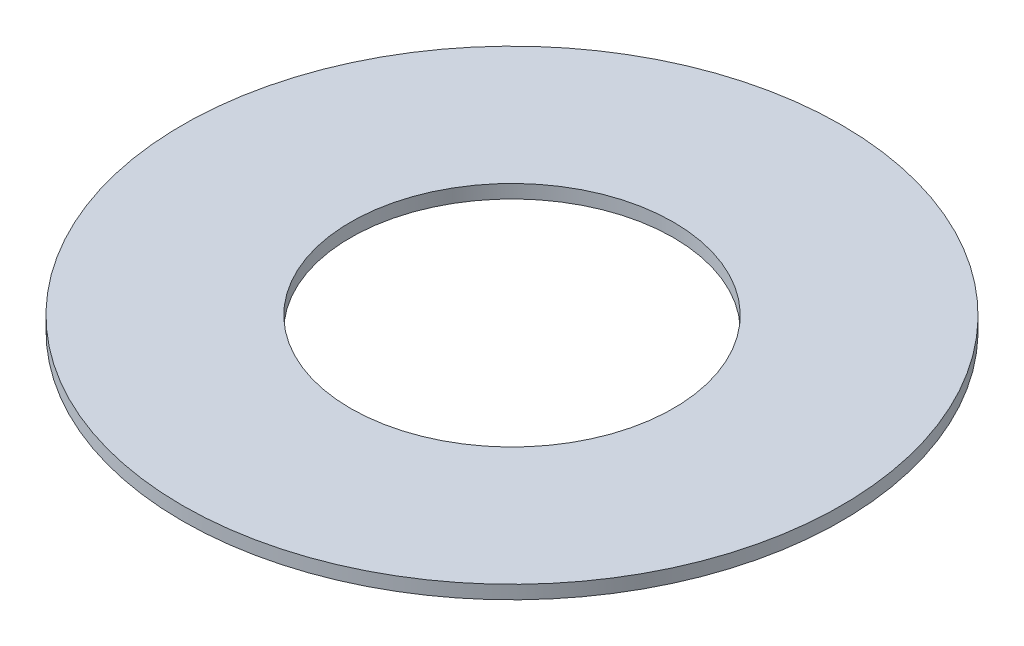
ISO-10303-21;
HEADER;
FILE_DESCRIPTION(('STEP AP214'),'2;1');
FILE_NAME('part.step','',(''),(''),'','','');
FILE_SCHEMA(('AUTOMOTIVE_DESIGN { 1 0 10303 214 1 1 1 1 }'));
ENDSEC;
DATA;
#1=APPLICATION_CONTEXT('core data for automotive mechanical design processes');
#2=APPLICATION_PROTOCOL_DEFINITION('international standard','automotive_design',2000,#1);
#3=PRODUCT_CONTEXT('',#1,'mechanical');
#4=PRODUCT('Part','Part','',(#3));
#5=PRODUCT_RELATED_PRODUCT_CATEGORY('part','',(#4));
#6=PRODUCT_DEFINITION_FORMATION('','',#4);
#7=PRODUCT_DEFINITION_CONTEXT('part definition',#1,'design');
#8=PRODUCT_DEFINITION('design','',#6,#7);
#9=PRODUCT_DEFINITION_SHAPE('','',#8);
#10=(LENGTH_UNIT() NAMED_UNIT(*) SI_UNIT(.MILLI.,.METRE.));
#11=(NAMED_UNIT(*) PLANE_ANGLE_UNIT() SI_UNIT($,.RADIAN.));
#12=(NAMED_UNIT(*) SI_UNIT($,.STERADIAN.) SOLID_ANGLE_UNIT());
#13=UNCERTAINTY_MEASURE_WITH_UNIT(LENGTH_MEASURE(1.E-05),#10,'distance_accuracy_value','');
#14=(GEOMETRIC_REPRESENTATION_CONTEXT(3) GLOBAL_UNCERTAINTY_ASSIGNED_CONTEXT((#13)) GLOBAL_UNIT_ASSIGNED_CONTEXT((#10,
#11,#12)) REPRESENTATION_CONTEXT('',''));
#15=CARTESIAN_POINT('',(0.,0.,0.));
#16=DIRECTION('',(0.,0.,1.));
#17=DIRECTION('',(1.,0.,0.));
#18=AXIS2_PLACEMENT_3D('',#15,#16,#17);
#19=CARTESIAN_POINT('',(0.,0.5,0.));
#20=DIRECTION('',(0.,1.,0.));
#21=DIRECTION('',(0.,0.,1.));
#22=AXIS2_PLACEMENT_3D('',#19,#20,#21);
#23=PLANE('',#22);
#24=CARTESIAN_POINT('',(0.,0.5,0.));
#25=DIRECTION('',(0.,1.,0.));
#26=DIRECTION('',(0.,0.,1.));
#27=AXIS2_PLACEMENT_3D('',#24,#25,#26);
#28=CIRCLE('',#27,12.25);
#29=CARTESIAN_POINT('',(0.,0.5,12.25));
#30=VERTEX_POINT('',#29);
#31=EDGE_CURVE('E10',#30,#30,#28,.T.);
#32=ORIENTED_EDGE('',*,*,#31,.T.);
#33=EDGE_LOOP('',(#32));
#34=FACE_BOUND('',#33,.T.);
#35=CARTESIAN_POINT('',(0.,0.5,0.));
#36=DIRECTION('',(0.,1.,0.));
#37=DIRECTION('',(0.,0.,1.));
#38=AXIS2_PLACEMENT_3D('',#35,#36,#37);
#39=CIRCLE('',#38,6.);
#40=CARTESIAN_POINT('',(0.,0.5,6.));
#41=VERTEX_POINT('',#40);
#42=EDGE_CURVE('E42',#41,#41,#39,.T.);
#43=ORIENTED_EDGE('',*,*,#42,.F.);
#44=EDGE_LOOP('',(#43));
#45=FACE_BOUND('',#44,.T.);
#46=ADVANCED_FACE('F31',(#34,#45),#23,.T.);
#47=CARTESIAN_POINT('',(0.,0.,0.));
#48=DIRECTION('',(0.,1.,0.));
#49=DIRECTION('',(0.,0.,1.));
#50=AXIS2_PLACEMENT_3D('',#47,#48,#49);
#51=PLANE('',#50);
#52=CARTESIAN_POINT('',(0.,0.,0.));
#53=DIRECTION('',(0.,1.,0.));
#54=DIRECTION('',(0.,0.,1.));
#55=AXIS2_PLACEMENT_3D('',#52,#53,#54);
#56=CIRCLE('',#55,12.25);
#57=CARTESIAN_POINT('',(0.,0.,12.25));
#58=VERTEX_POINT('',#57);
#59=EDGE_CURVE('E35',#58,#58,#56,.T.);
#60=ORIENTED_EDGE('',*,*,#59,.F.);
#61=EDGE_LOOP('',(#60));
#62=FACE_BOUND('',#61,.T.);
#63=CARTESIAN_POINT('',(0.,0.,0.));
#64=DIRECTION('',(0.,1.,0.));
#65=DIRECTION('',(0.,0.,1.));
#66=AXIS2_PLACEMENT_3D('',#63,#64,#65);
#67=CIRCLE('',#66,6.);
#68=CARTESIAN_POINT('',(0.,0.,6.));
#69=VERTEX_POINT('',#68);
#70=EDGE_CURVE('E44',#69,#69,#67,.T.);
#71=ORIENTED_EDGE('',*,*,#70,.T.);
#72=EDGE_LOOP('',(#71));
#73=FACE_BOUND('',#72,.T.);
#74=ADVANCED_FACE('F54',(#62,#73),#51,.F.);
#75=CARTESIAN_POINT('',(0.,0.5,0.));
#76=DIRECTION('',(0.,-1.,0.));
#77=DIRECTION('',(0.,0.,-1.));
#78=AXIS2_PLACEMENT_3D('',#75,#76,#77);
#79=CYLINDRICAL_SURFACE('',#78,12.25);
#80=ORIENTED_EDGE('',*,*,#31,.F.);
#81=EDGE_LOOP('',(#80));
#82=FACE_BOUND('',#81,.T.);
#83=ORIENTED_EDGE('',*,*,#59,.T.);
#84=EDGE_LOOP('',(#83));
#85=FACE_BOUND('',#84,.T.);
#86=ADVANCED_FACE('F33',(#82,#85),#79,.T.);
#87=CARTESIAN_POINT('',(0.,0.5,0.));
#88=DIRECTION('',(0.,-1.,0.));
#89=DIRECTION('',(0.,0.,-1.));
#90=AXIS2_PLACEMENT_3D('',#87,#88,#89);
#91=CYLINDRICAL_SURFACE('',#90,6.);
#92=ORIENTED_EDGE('',*,*,#42,.T.);
#93=EDGE_LOOP('',(#92));
#94=FACE_BOUND('',#93,.T.);
#95=ORIENTED_EDGE('',*,*,#70,.F.);
#96=EDGE_LOOP('',(#95));
#97=FACE_BOUND('',#96,.T.);
#98=ADVANCED_FACE('F50',(#94,#97),#91,.F.);
#99=CLOSED_SHELL('',(#46,#74,#86,#98));
#100=MANIFOLD_SOLID_BREP('B2',#99);
#101=ADVANCED_BREP_SHAPE_REPRESENTATION('',(#18,#100),#14);
#102=SHAPE_DEFINITION_REPRESENTATION(#9,#101);
ENDSEC;
END-ISO-10303-21;
